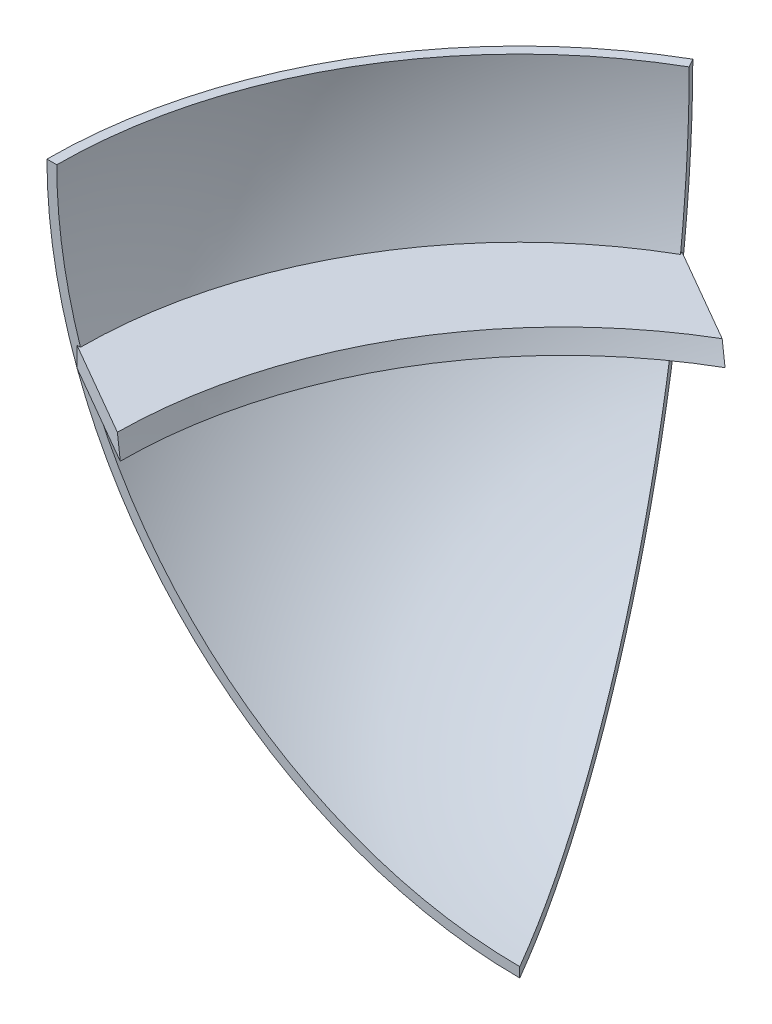
ISO-10303-21;
HEADER;
FILE_DESCRIPTION(('STEP AP214'),'2;1');
FILE_NAME('part.step','',(''),(''),'','','');
FILE_SCHEMA(('AUTOMOTIVE_DESIGN { 1 0 10303 214 1 1 1 1 }'));
ENDSEC;
DATA;
#1=APPLICATION_CONTEXT('core data for automotive mechanical design processes');
#2=APPLICATION_PROTOCOL_DEFINITION('international standard','automotive_design',2000,#1);
#3=PRODUCT_CONTEXT('',#1,'mechanical');
#4=PRODUCT('Part','Part','',(#3));
#5=PRODUCT_RELATED_PRODUCT_CATEGORY('part','',(#4));
#6=PRODUCT_DEFINITION_FORMATION('','',#4);
#7=PRODUCT_DEFINITION_CONTEXT('part definition',#1,'design');
#8=PRODUCT_DEFINITION('design','',#6,#7);
#9=PRODUCT_DEFINITION_SHAPE('','',#8);
#10=(LENGTH_UNIT() NAMED_UNIT(*) SI_UNIT(.MILLI.,.METRE.));
#11=(NAMED_UNIT(*) PLANE_ANGLE_UNIT() SI_UNIT($,.RADIAN.));
#12=(NAMED_UNIT(*) SI_UNIT($,.STERADIAN.) SOLID_ANGLE_UNIT());
#13=UNCERTAINTY_MEASURE_WITH_UNIT(LENGTH_MEASURE(1.E-05),#10,'distance_accuracy_value','');
#14=(GEOMETRIC_REPRESENTATION_CONTEXT(3) GLOBAL_UNCERTAINTY_ASSIGNED_CONTEXT((#13)) GLOBAL_UNIT_ASSIGNED_CONTEXT((#10,
#11,#12)) REPRESENTATION_CONTEXT('',''));
#15=CARTESIAN_POINT('',(0.,0.,0.));
#16=DIRECTION('',(0.,0.,1.));
#17=DIRECTION('',(1.,0.,0.));
#18=AXIS2_PLACEMENT_3D('',#15,#16,#17);
#19=CARTESIAN_POINT('',(0.,0.,0.));
#20=DIRECTION('',(-0.86602540378444,0.,0.5));
#21=DIRECTION('',(0.5,0.,0.86602540378444));
#22=AXIS2_PLACEMENT_3D('',#19,#20,#21);
#23=PLANE('',#22);
#24=CARTESIAN_POINT('',(0.,0.,0.));
#25=DIRECTION('',(-0.86602540378444,0.,0.5));
#26=DIRECTION('',(0.5,0.,0.86602540378444));
#27=AXIS2_PLACEMENT_3D('',#24,#25,#26);
#28=CIRCLE('',#27,304.8);
#29=CARTESIAN_POINT('',(-142.709906569512,-106.951251828503,-247.180808921803));
#30=VERTEX_POINT('',#29);
#31=CARTESIAN_POINT('',(0.,-304.8,0.));
#32=VERTEX_POINT('',#31);
#33=EDGE_CURVE('E261',#30,#32,#28,.T.);
#34=ORIENTED_EDGE('',*,*,#33,.F.);
#35=DIRECTION('',(0.499999999999999,0.,0.866025403784439));
#36=VECTOR('',#35,1.);
#37=CARTESIAN_POINT('',(0.,-106.951251828503,0.));
#38=LINE('',#37,#36);
#39=CARTESIAN_POINT('',(-139.314242122186,-106.951251828503,-241.299345573578));
#40=VERTEX_POINT('',#39);
#41=EDGE_CURVE('E271',#30,#40,#38,.T.);
#42=ORIENTED_EDGE('',*,*,#41,.T.);
#43=CARTESIAN_POINT('',(0.,0.,0.));
#44=DIRECTION('',(0.86602540378444,0.,-0.5));
#45=DIRECTION('',(0.5,0.,0.86602540378444));
#46=AXIS2_PLACEMENT_3D('',#43,#44,#45);
#47=CIRCLE('',#46,298.45);
#48=CARTESIAN_POINT('',(0.,-298.45,0.));
#49=VERTEX_POINT('',#48);
#50=EDGE_CURVE('E300',#49,#40,#47,.T.);
#51=ORIENTED_EDGE('',*,*,#50,.F.);
#52=DIRECTION('',(0.,1.,0.));
#53=VECTOR('',#52,1.);
#54=CARTESIAN_POINT('',(0.,-298.45,0.));
#55=LINE('',#54,#53);
#56=EDGE_CURVE('E268',#32,#49,#55,.T.);
#57=ORIENTED_EDGE('',*,*,#56,.F.);
#58=EDGE_LOOP('',(#34,#42,#51,#57));
#59=FACE_BOUND('',#58,.T.);
#60=ADVANCED_FACE('F53',(#59),#23,.F.);
#61=CARTESIAN_POINT('',(0.,-298.45,0.));
#62=DIRECTION('',(0.,0.,1.));
#63=DIRECTION('',(1.,0.,0.));
#64=AXIS2_PLACEMENT_3D('',#61,#62,#63);
#65=PLANE('',#64);
#66=DIRECTION('',(1.,0.,0.));
#67=VECTOR('',#66,1.);
#68=CARTESIAN_POINT('',(0.,-106.951251828503,5.03600359976182E-13));
#69=LINE('',#68,#67);
#70=CARTESIAN_POINT('',(-285.419813139025,-106.951251828503,1.54930319913899E-12));
#71=VERTEX_POINT('',#70);
#72=CARTESIAN_POINT('',(-278.628484244372,-106.951251828503,1.52442156310706E-12));
#73=VERTEX_POINT('',#72);
#74=EDGE_CURVE('E275',#71,#73,#69,.T.);
#75=ORIENTED_EDGE('',*,*,#74,.F.);
#76=CARTESIAN_POINT('',(0.,0.,7.75831998632044E-13));
#77=DIRECTION('',(0.,0.,1.));
#78=DIRECTION('',(1.,0.,0.));
#79=AXIS2_PLACEMENT_3D('',#76,#77,#78);
#80=CIRCLE('',#79,304.8);
#81=EDGE_CURVE('E320',#71,#32,#80,.T.);
#82=ORIENTED_EDGE('',*,*,#81,.T.);
#83=ORIENTED_EDGE('',*,*,#56,.T.);
#84=CARTESIAN_POINT('',(0.,0.,7.75831998632044E-13));
#85=DIRECTION('',(0.,0.,1.));
#86=DIRECTION('',(1.,0.,0.));
#87=AXIS2_PLACEMENT_3D('',#84,#85,#86);
#88=CIRCLE('',#87,298.45);
#89=EDGE_CURVE('E327',#49,#73,#88,.F.);
#90=ORIENTED_EDGE('',*,*,#89,.T.);
#91=EDGE_LOOP('',(#75,#82,#83,#90));
#92=FACE_BOUND('',#91,.T.);
#93=ADVANCED_FACE('F230',(#92),#65,.T.);
#94=CARTESIAN_POINT('',(0.,0.,0.));
#95=DIRECTION('',(0.,1.,0.));
#96=DIRECTION('',(0.5,0.,0.86602540378444));
#97=AXIS2_PLACEMENT_3D('',#94,#95,#96);
#98=SPHERICAL_SURFACE('',#97,298.45);
#99=CARTESIAN_POINT('',(0.,-106.951251828503,0.));
#100=DIRECTION('',(0.,-1.,0.));
#101=DIRECTION('',(1.,0.,0.));
#102=AXIS2_PLACEMENT_3D('',#99,#100,#101);
#103=CIRCLE('',#102,278.628484244372);
#104=EDGE_CURVE('E11',#73,#40,#103,.T.);
#105=ORIENTED_EDGE('',*,*,#104,.F.);
#106=ORIENTED_EDGE('',*,*,#89,.F.);
#107=ORIENTED_EDGE('',*,*,#50,.T.);
#108=EDGE_LOOP('',(#105,#106,#107));
#109=FACE_BOUND('',#108,.T.);
#110=ADVANCED_FACE('F228',(#109),#98,.F.);
#111=CARTESIAN_POINT('',(-149.225,0.,-258.465281759466));
#112=DIRECTION('',(0.,1.,0.));
#113=DIRECTION('',(0.,0.,1.));
#114=AXIS2_PLACEMENT_3D('',#111,#112,#113);
#115=PLANE('',#114);
#116=DIRECTION('',(-1.,0.,0.));
#117=VECTOR('',#116,1.);
#118=CARTESIAN_POINT('',(0.,0.,7.75831998632044E-13));
#119=LINE('',#118,#117);
#120=CARTESIAN_POINT('',(-298.45,0.,1.86927400223999E-12));
#121=VERTEX_POINT('',#120);
#122=CARTESIAN_POINT('',(-304.8,0.,1.89253872572101E-12));
#123=VERTEX_POINT('',#122);
#124=EDGE_CURVE('E323',#121,#123,#119,.T.);
#125=ORIENTED_EDGE('',*,*,#124,.F.);
#126=CARTESIAN_POINT('',(0.,0.,0.));
#127=DIRECTION('',(0.,1.,0.));
#128=DIRECTION('',(0.,0.,1.));
#129=AXIS2_PLACEMENT_3D('',#126,#127,#128);
#130=CIRCLE('',#129,298.45);
#131=CARTESIAN_POINT('',(-149.225,0.,-258.465281759466));
#132=VERTEX_POINT('',#131);
#133=EDGE_CURVE('E303',#132,#121,#130,.T.);
#134=ORIENTED_EDGE('',*,*,#133,.F.);
#135=DIRECTION('',(-0.5,0.,-0.86602540378444));
#136=VECTOR('',#135,1.);
#137=CARTESIAN_POINT('',(-149.225,0.,-258.465281759466));
#138=LINE('',#137,#136);
#139=CARTESIAN_POINT('',(-152.4,0.,-263.964543073498));
#140=VERTEX_POINT('',#139);
#141=EDGE_CURVE('E308',#132,#140,#138,.T.);
#142=ORIENTED_EDGE('',*,*,#141,.T.);
#143=CARTESIAN_POINT('',(0.,0.,0.));
#144=DIRECTION('',(0.,1.,0.));
#145=DIRECTION('',(0.,0.,1.));
#146=AXIS2_PLACEMENT_3D('',#143,#144,#145);
#147=CIRCLE('',#146,304.8);
#148=EDGE_CURVE('E265',#140,#123,#147,.T.);
#149=ORIENTED_EDGE('',*,*,#148,.T.);
#150=EDGE_LOOP('',(#125,#134,#142,#149));
#151=FACE_BOUND('',#150,.T.);
#152=ADVANCED_FACE('F241',(#151),#115,.T.);
#153=DIRECTION('',(-0.499999999999999,0.,-0.866025403784439));
#154=VECTOR('',#153,1.);
#155=CARTESIAN_POINT('',(0.,-94.2512518285033,0.));
#156=LINE('',#155,#154);
#157=CARTESIAN_POINT('',(-141.588403505337,-94.2512518285033,-245.238308633807));
#158=VERTEX_POINT('',#157);
#159=CARTESIAN_POINT('',(-142.709906569512,-94.2512518285033,-247.180808921804));
#160=VERTEX_POINT('',#159);
#161=EDGE_CURVE('E71',#158,#160,#156,.T.);
#162=ORIENTED_EDGE('',*,*,#161,.T.);
#163=DIRECTION('',(0.,-1.,0.));
#164=VECTOR('',#163,1.);
#165=CARTESIAN_POINT('',(-142.709906569514,-9.49712485774018E-12,-247.180808921806));
#166=LINE('',#165,#164);
#167=EDGE_CURVE('E277',#160,#30,#166,.T.);
#168=ORIENTED_EDGE('',*,*,#167,.T.);
#169=EDGE_CURVE('E57',#140,#30,#28,.T.);
#170=ORIENTED_EDGE('',*,*,#169,.F.);
#171=ORIENTED_EDGE('',*,*,#141,.F.);
#172=EDGE_CURVE('E297',#158,#132,#47,.T.);
#173=ORIENTED_EDGE('',*,*,#172,.F.);
#174=EDGE_LOOP('',(#162,#168,#170,#171,#173));
#175=FACE_BOUND('',#174,.T.);
#176=ADVANCED_FACE('F232',(#175),#23,.F.);
#177=DIRECTION('',(0.,-1.,0.));
#178=VECTOR('',#177,1.);
#179=CARTESIAN_POINT('',(-285.419813139026,-298.449999999999,1.06186600580098E-12));
#180=LINE('',#179,#178);
#181=CARTESIAN_POINT('',(-285.419813139025,-94.2512518285032,1.54845524434054E-12));
#182=VERTEX_POINT('',#181);
#183=EDGE_CURVE('E79',#182,#71,#180,.T.);
#184=ORIENTED_EDGE('',*,*,#183,.F.);
#185=DIRECTION('',(-1.,0.,0.));
#186=VECTOR('',#185,1.);
#187=CARTESIAN_POINT('',(0.,-94.2512518285033,5.35926693252517E-13));
#188=LINE('',#187,#186);
#189=CARTESIAN_POINT('',(-283.176807010673,-94.2512518285032,1.57341175015669E-12));
#190=VERTEX_POINT('',#189);
#191=EDGE_CURVE('E142',#190,#182,#188,.T.);
#192=ORIENTED_EDGE('',*,*,#191,.F.);
#193=EDGE_CURVE('E307',#190,#121,#88,.F.);
#194=ORIENTED_EDGE('',*,*,#193,.T.);
#195=ORIENTED_EDGE('',*,*,#124,.T.);
#196=EDGE_CURVE('E310',#123,#71,#80,.T.);
#197=ORIENTED_EDGE('',*,*,#196,.T.);
#198=EDGE_LOOP('',(#184,#192,#194,#195,#197));
#199=FACE_BOUND('',#198,.T.);
#200=ADVANCED_FACE('F55',(#199),#65,.T.);
#201=CARTESIAN_POINT('',(0.,0.,0.));
#202=DIRECTION('',(0.,1.,0.));
#203=DIRECTION('',(-0.5,0.,-0.86602540378444));
#204=AXIS2_PLACEMENT_3D('',#201,#202,#203);
#205=SPHERICAL_SURFACE('',#204,304.8);
#206=ORIENTED_EDGE('',*,*,#169,.T.);
#207=ORIENTED_EDGE('',*,*,#33,.T.);
#208=ORIENTED_EDGE('',*,*,#81,.F.);
#209=ORIENTED_EDGE('',*,*,#196,.F.);
#210=ORIENTED_EDGE('',*,*,#148,.F.);
#211=EDGE_LOOP('',(#206,#207,#208,#209,#210));
#212=FACE_BOUND('',#211,.T.);
#213=ADVANCED_FACE('F226',(#212),#205,.T.);
#214=CARTESIAN_POINT('',(0.,-94.2512518285033,0.));
#215=DIRECTION('',(0.,1.,0.));
#216=DIRECTION('',(-1.,0.,0.));
#217=AXIS2_PLACEMENT_3D('',#214,#215,#216);
#218=CIRCLE('',#217,283.176807010673);
#219=EDGE_CURVE('E63',#158,#190,#218,.T.);
#220=ORIENTED_EDGE('',*,*,#219,.F.);
#221=ORIENTED_EDGE('',*,*,#172,.T.);
#222=ORIENTED_EDGE('',*,*,#133,.T.);
#223=ORIENTED_EDGE('',*,*,#193,.F.);
#224=EDGE_LOOP('',(#220,#221,#222,#223));
#225=FACE_BOUND('',#224,.T.);
#226=ADVANCED_FACE('F188',(#225),#98,.F.);
#227=CARTESIAN_POINT('',(-147.140396944398,-94.2512518285033,-249.738753732386));
#228=DIRECTION('',(0.499999999999998,0.,-0.86602540378444));
#229=DIRECTION('',(-0.86602540378444,0.,-0.499999999999998));
#230=AXIS2_PLACEMENT_3D('',#227,#228,#229);
#231=PLANE('',#230);
#232=ORIENTED_EDGE('',*,*,#167,.F.);
#233=DIRECTION('',(0.86602540378444,0.,0.499999999999998));
#234=VECTOR('',#233,1.);
#235=CARTESIAN_POINT('',(-147.140396944398,-94.2512518285033,-249.738753732386));
#236=LINE('',#235,#234);
#237=CARTESIAN_POINT('',(-81.1492611760235,-94.2512518285033,-211.638753732386));
#238=VERTEX_POINT('',#237);
#239=EDGE_CURVE('E213',#160,#238,#236,.T.);
#240=ORIENTED_EDGE('',*,*,#239,.T.);
#241=CARTESIAN_POINT('',(-76.7187708011383,-106.951251828503,-209.080808921804));
#242=CARTESIAN_POINT('',(-76.9130041071132,-106.43290335275,-209.192949538037));
#243=CARTESIAN_POINT('',(-77.1058256909697,-105.913849446801,-209.30427463439));
#244=CARTESIAN_POINT('',(-77.4891919674824,-104.87284549184,-209.525609874648));
#245=CARTESIAN_POINT('',(-77.679728445323,-104.35089140893,-209.635615274607));
#246=CARTESIAN_POINT('',(-78.0584933038081,-103.304091536693,-209.854293644147));
#247=CARTESIAN_POINT('',(-78.2467133998472,-102.779241750609,-209.962961831051));
#248=CARTESIAN_POINT('',(-78.6208143509724,-101.726655259801,-210.178948088115));
#249=CARTESIAN_POINT('',(-78.8066868518654,-101.198914596431,-210.286261336272));
#250=CARTESIAN_POINT('',(-79.1760614432913,-100.140551460665,-210.499519833018));
#251=CARTESIAN_POINT('',(-79.3595551099936,-99.6099250686254,-210.605460219722));
#252=CARTESIAN_POINT('',(-79.7241408744245,-98.545795921267,-210.815954906962));
#253=CARTESIAN_POINT('',(-79.9052244787445,-98.0122892862392,-210.920504305156));
#254=CARTESIAN_POINT('',(-80.2649589426518,-96.9424054285477,-211.128198727116));
#255=CARTESIAN_POINT('',(-80.4436012392346,-96.406024367025,-211.23133880752));
#256=CARTESIAN_POINT('',(-80.7984220004719,-95.3303977941651,-211.436196087736));
#257=CARTESIAN_POINT('',(-80.9745918328184,-94.7911484858283,-211.537908302557));
#258=CARTESIAN_POINT('',(-81.1492611760237,-94.2512518285033,-211.638753732386));
#259=B_SPLINE_CURVE_WITH_KNOTS('',3,(#241,#242,#243,#244,#245,#246,#247,#248,#249,#250,#251,
#252,#253,#254,#255,#256,#257,#258),.UNSPECIFIED.,.F.,.F.,(4,2,2,2,2,2,2,2,4),(0.,
1.69436587066387,3.39364051171139,5.09783742829825,6.80697028750376,8.52105291632171,
10.2400992995317,11.9641235774511,13.693140043568),.UNSPECIFIED.);
#260=CARTESIAN_POINT('',(-76.7187708011382,-106.951251828503,-209.080808921804));
#261=VERTEX_POINT('',#260);
#262=EDGE_CURVE('E153',#261,#238,#259,.T.);
#263=ORIENTED_EDGE('',*,*,#262,.F.);
#264=DIRECTION('',(0.86602540378444,0.,0.499999999999998));
#265=VECTOR('',#264,1.);
#266=CARTESIAN_POINT('',(-142.709906569513,-106.951251828503,-247.180808921803));
#267=LINE('',#266,#265);
#268=EDGE_CURVE('E169',#30,#261,#267,.T.);
#269=ORIENTED_EDGE('',*,*,#268,.F.);
#270=EDGE_LOOP('',(#232,#240,#263,#269));
#271=FACE_BOUND('',#270,.T.);
#272=ADVANCED_FACE('F184',(#271),#231,.T.);
#273=CARTESIAN_POINT('',(65.9911357683743,0.,38.0999999999999));
#274=DIRECTION('',(0.,1.,0.));
#275=DIRECTION('',(-0.5,0.,-0.86602540378444));
#276=AXIS2_PLACEMENT_3D('',#273,#274,#275);
#277=SPHERICAL_SURFACE('',#276,304.8);
#278=CARTESIAN_POINT('',(65.9911357683743,-94.2512518285033,38.0999999999999));
#279=DIRECTION('',(0.,1.,0.));
#280=DIRECTION('',(-1.,0.,0.));
#281=AXIS2_PLACEMENT_3D('',#278,#279,#280);
#282=CIRCLE('',#281,289.861590295713);
#283=CARTESIAN_POINT('',(-223.859167745536,-94.2512518285032,35.5420551894193));
#284=VERTEX_POINT('',#283);
#285=EDGE_CURVE('E140',#238,#284,#282,.T.);
#286=ORIENTED_EDGE('',*,*,#285,.T.);
#287=CARTESIAN_POINT('',(-223.859167745537,-94.251251828503,35.5420551894194));
#288=CARTESIAN_POINT('',(-223.684498369847,-94.7911484858281,35.6429005629832));
#289=CARTESIAN_POINT('',(-223.508328091763,-95.3303977941651,35.7446120057652));
#290=CARTESIAN_POINT('',(-223.153506102327,-96.4060243670252,35.9494671586786));
#291=CARTESIAN_POINT('',(-222.974863024258,-96.9424054285481,36.052605885508));
#292=CARTESIAN_POINT('',(-222.615127146662,-98.0122892862398,36.2602978588884));
#293=CARTESIAN_POINT('',(-222.434042909715,-98.5457959212676,36.3648461613412));
#294=CARTESIAN_POINT('',(-222.069456280989,-99.6099250686261,36.5753393515768));
#295=CARTESIAN_POINT('',(-221.885962381465,-100.140551460665,36.6812793350224));
#296=CARTESIAN_POINT('',(-221.516587809998,-101.198914596432,36.894537866337));
#297=CARTESIAN_POINT('',(-221.330715560484,-101.726655259801,37.0018515498966));
#298=CARTESIAN_POINT('',(-220.956615499436,-102.77924175061,37.217839348619));
#299=CARTESIAN_POINT('',(-220.768396040974,-103.304091536694,37.3265086398392));
#300=CARTESIAN_POINT('',(-220.389632588452,-104.35089140893,37.5451894445782));
#301=CARTESIAN_POINT('',(-220.199096878614,-104.87284549184,37.6551961747567));
#302=CARTESIAN_POINT('',(-219.815731799541,-105.913849446801,37.8765334890415));
#303=CARTESIAN_POINT('',(-219.622910646093,-106.43290335275,37.9878593308829));
#304=CARTESIAN_POINT('',(-219.428677370651,-106.951251828503,38.1000000000014));
#305=B_SPLINE_CURVE_WITH_KNOTS('',3,(#287,#288,#289,#290,#291,#292,#293,#294,#295,#296,#297,
#298,#299,#300,#301,#302,#303,#304),.UNSPECIFIED.,.F.,.F.,(4,2,2,2,2,2,2,2,4),(0.,
1.72901646611733,3.45304074403711,5.1720871272473,6.8861697560653,8.59530261527076,
10.2994995318574,11.9987741729046,13.693140043568),.UNSPECIFIED.);
#306=CARTESIAN_POINT('',(-219.428677370651,-106.951251828503,38.1000000000014));
#307=VERTEX_POINT('',#306);
#308=EDGE_CURVE('E145',#284,#307,#305,.T.);
#309=ORIENTED_EDGE('',*,*,#308,.T.);
#310=CARTESIAN_POINT('',(65.9911357683743,-106.951251828503,38.0999999999999));
#311=DIRECTION('',(0.,-1.,0.));
#312=DIRECTION('',(1.,0.,0.));
#313=AXIS2_PLACEMENT_3D('',#310,#311,#312);
#314=CIRCLE('',#313,285.419813139025);
#315=EDGE_CURVE('E278',#307,#261,#314,.T.);
#316=ORIENTED_EDGE('',*,*,#315,.T.);
#317=ORIENTED_EDGE('',*,*,#262,.T.);
#318=EDGE_LOOP('',(#286,#309,#316,#317));
#319=FACE_BOUND('',#318,.T.);
#320=ADVANCED_FACE('F149',(#319),#277,.F.);
#321=CARTESIAN_POINT('',(-142.709906569513,-106.951251828503,-247.180808921803));
#322=DIRECTION('',(0.,-1.,0.));
#323=DIRECTION('',(1.,0.,0.));
#324=AXIS2_PLACEMENT_3D('',#321,#322,#323);
#325=PLANE('',#324);
#326=ORIENTED_EDGE('',*,*,#41,.F.);
#327=ORIENTED_EDGE('',*,*,#268,.T.);
#328=ORIENTED_EDGE('',*,*,#315,.F.);
#329=DIRECTION('',(0.86602540378444,0.,0.499999999999998));
#330=VECTOR('',#329,1.);
#331=CARTESIAN_POINT('',(-285.419813139025,-106.951251828503,1.55431223447522E-12));
#332=LINE('',#331,#330);
#333=EDGE_CURVE('E159',#71,#307,#332,.T.);
#334=ORIENTED_EDGE('',*,*,#333,.F.);
#335=ORIENTED_EDGE('',*,*,#74,.T.);
#336=ORIENTED_EDGE('',*,*,#104,.T.);
#337=EDGE_LOOP('',(#326,#327,#328,#334,#335,#336));
#338=FACE_BOUND('',#337,.T.);
#339=ADVANCED_FACE('F180',(#338),#325,.T.);
#340=CARTESIAN_POINT('',(-285.419813139025,-106.951251828503,1.55431223447522E-12));
#341=DIRECTION('',(-0.499999999999998,0.,0.86602540378444));
#342=DIRECTION('',(0.86602540378444,0.,0.499999999999998));
#343=AXIS2_PLACEMENT_3D('',#340,#341,#342);
#344=PLANE('',#343);
#345=DIRECTION('',(0.86602540378444,0.,0.499999999999998));
#346=VECTOR('',#345,1.);
#347=CARTESIAN_POINT('',(-289.850303513911,-94.2512518285032,-2.55794481058049));
#348=LINE('',#347,#346);
#349=EDGE_CURVE('E136',#182,#284,#348,.T.);
#350=ORIENTED_EDGE('',*,*,#349,.F.);
#351=ORIENTED_EDGE('',*,*,#183,.T.);
#352=ORIENTED_EDGE('',*,*,#333,.T.);
#353=ORIENTED_EDGE('',*,*,#308,.F.);
#354=EDGE_LOOP('',(#350,#351,#352,#353));
#355=FACE_BOUND('',#354,.T.);
#356=ADVANCED_FACE('F157',(#355),#344,.T.);
#357=CARTESIAN_POINT('',(-289.850303513911,-94.2512518285032,-2.55794481058049));
#358=DIRECTION('',(0.,1.,0.));
#359=DIRECTION('',(-1.,0.,0.));
#360=AXIS2_PLACEMENT_3D('',#357,#358,#359);
#361=PLANE('',#360);
#362=ORIENTED_EDGE('',*,*,#161,.F.);
#363=ORIENTED_EDGE('',*,*,#219,.T.);
#364=ORIENTED_EDGE('',*,*,#191,.T.);
#365=ORIENTED_EDGE('',*,*,#349,.T.);
#366=ORIENTED_EDGE('',*,*,#285,.F.);
#367=ORIENTED_EDGE('',*,*,#239,.F.);
#368=EDGE_LOOP('',(#362,#363,#364,#365,#366,#367));
#369=FACE_BOUND('',#368,.T.);
#370=ADVANCED_FACE('F138',(#369),#361,.T.);
#371=CLOSED_SHELL('',(#60,#93,#110,#152,#176,#200,#213,#226,#272,#320,#339,#356,#370));
#372=MANIFOLD_SOLID_BREP('B2',#371);
#373=ADVANCED_BREP_SHAPE_REPRESENTATION('',(#18,#372),#14);
#374=SHAPE_DEFINITION_REPRESENTATION(#9,#373);
ENDSEC;
END-ISO-10303-21;
